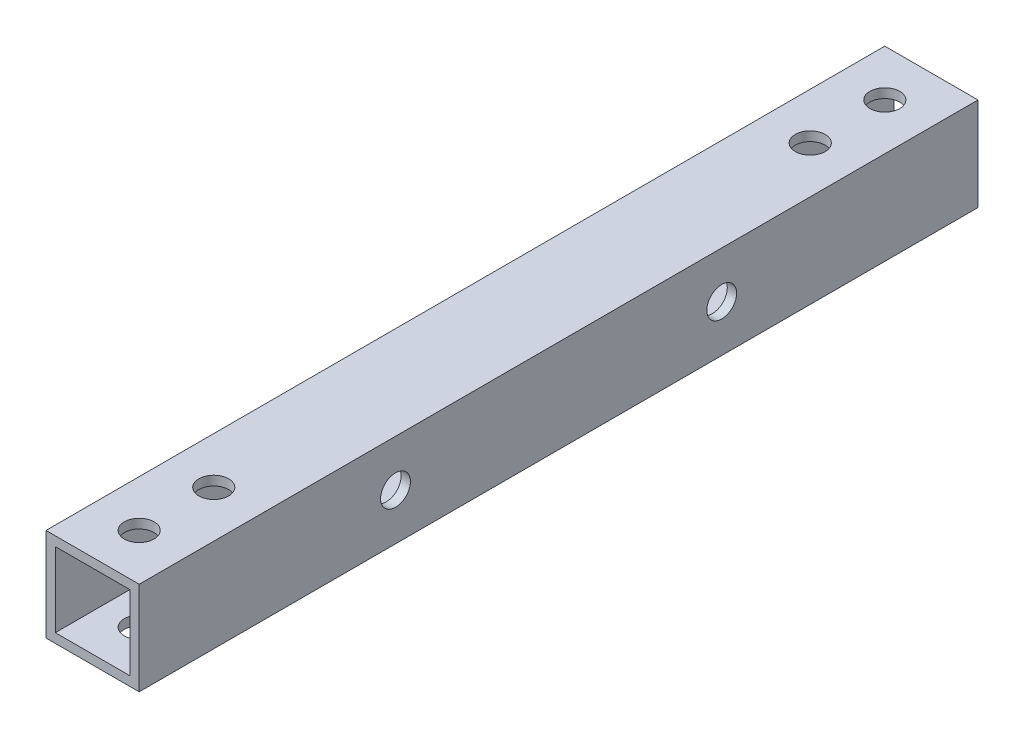
ISO-10303-21;
HEADER;
FILE_DESCRIPTION(('STEP AP214'),'2;1');
FILE_NAME('part.step','',(''),(''),'','','');
FILE_SCHEMA(('AUTOMOTIVE_DESIGN { 1 0 10303 214 1 1 1 1 }'));
ENDSEC;
DATA;
#1=APPLICATION_CONTEXT('core data for automotive mechanical design processes');
#2=APPLICATION_PROTOCOL_DEFINITION('international standard','automotive_design',2000,#1);
#3=PRODUCT_CONTEXT('',#1,'mechanical');
#4=PRODUCT('Part','Part','',(#3));
#5=PRODUCT_RELATED_PRODUCT_CATEGORY('part','',(#4));
#6=PRODUCT_DEFINITION_FORMATION('','',#4);
#7=PRODUCT_DEFINITION_CONTEXT('part definition',#1,'design');
#8=PRODUCT_DEFINITION('design','',#6,#7);
#9=PRODUCT_DEFINITION_SHAPE('','',#8);
#10=(LENGTH_UNIT() NAMED_UNIT(*) SI_UNIT(.MILLI.,.METRE.));
#11=(NAMED_UNIT(*) PLANE_ANGLE_UNIT() SI_UNIT($,.RADIAN.));
#12=(NAMED_UNIT(*) SI_UNIT($,.STERADIAN.) SOLID_ANGLE_UNIT());
#13=UNCERTAINTY_MEASURE_WITH_UNIT(LENGTH_MEASURE(1.E-05),#10,'distance_accuracy_value','');
#14=(GEOMETRIC_REPRESENTATION_CONTEXT(3) GLOBAL_UNCERTAINTY_ASSIGNED_CONTEXT((#13)) GLOBAL_UNIT_ASSIGNED_CONTEXT((#10,
#11,#12)) REPRESENTATION_CONTEXT('',''));
#15=CARTESIAN_POINT('',(0.,0.,0.));
#16=DIRECTION('',(0.,0.,1.));
#17=DIRECTION('',(1.,0.,0.));
#18=AXIS2_PLACEMENT_3D('',#15,#16,#17);
#19=CARTESIAN_POINT('',(0.,0.,90.));
#20=DIRECTION('',(0.,0.,1.));
#21=DIRECTION('',(1.,0.,0.));
#22=AXIS2_PLACEMENT_3D('',#19,#20,#21);
#23=PLANE('',#22);
#24=DIRECTION('',(0.,1.,0.));
#25=VECTOR('',#24,1.);
#26=CARTESIAN_POINT('',(5.,-5.,90.));
#27=LINE('',#26,#25);
#28=CARTESIAN_POINT('',(5.,-5.,90.));
#29=VERTEX_POINT('',#28);
#30=CARTESIAN_POINT('',(5.,5.,90.));
#31=VERTEX_POINT('',#30);
#32=EDGE_CURVE('E162',#29,#31,#27,.T.);
#33=ORIENTED_EDGE('',*,*,#32,.T.);
#34=DIRECTION('',(-1.,0.,0.));
#35=VECTOR('',#34,1.);
#36=CARTESIAN_POINT('',(-5.,5.,90.));
#37=LINE('',#36,#35);
#38=CARTESIAN_POINT('',(-5.,5.,90.));
#39=VERTEX_POINT('',#38);
#40=EDGE_CURVE('E165',#31,#39,#37,.T.);
#41=ORIENTED_EDGE('',*,*,#40,.T.);
#42=DIRECTION('',(0.,-1.,0.));
#43=VECTOR('',#42,1.);
#44=CARTESIAN_POINT('',(-5.,-5.,90.));
#45=LINE('',#44,#43);
#46=CARTESIAN_POINT('',(-5.,-5.,90.));
#47=VERTEX_POINT('',#46);
#48=EDGE_CURVE('E168',#39,#47,#45,.T.);
#49=ORIENTED_EDGE('',*,*,#48,.T.);
#50=DIRECTION('',(1.,0.,0.));
#51=VECTOR('',#50,1.);
#52=CARTESIAN_POINT('',(-5.,-5.,90.));
#53=LINE('',#52,#51);
#54=EDGE_CURVE('E170',#47,#29,#53,.T.);
#55=ORIENTED_EDGE('',*,*,#54,.T.);
#56=EDGE_LOOP('',(#33,#41,#49,#55));
#57=FACE_BOUND('',#56,.T.);
#58=DIRECTION('',(-1.,0.,0.));
#59=VECTOR('',#58,1.);
#60=CARTESIAN_POINT('',(0.,4.,90.));
#61=LINE('',#60,#59);
#62=CARTESIAN_POINT('',(4.,4.,90.));
#63=VERTEX_POINT('',#62);
#64=CARTESIAN_POINT('',(-4.,4.,90.));
#65=VERTEX_POINT('',#64);
#66=EDGE_CURVE('E132',#63,#65,#61,.T.);
#67=ORIENTED_EDGE('',*,*,#66,.F.);
#68=DIRECTION('',(0.,1.,0.));
#69=VECTOR('',#68,1.);
#70=CARTESIAN_POINT('',(4.,0.,90.));
#71=LINE('',#70,#69);
#72=CARTESIAN_POINT('',(4.,-4.,90.));
#73=VERTEX_POINT('',#72);
#74=EDGE_CURVE('E124',#73,#63,#71,.T.);
#75=ORIENTED_EDGE('',*,*,#74,.F.);
#76=DIRECTION('',(1.,0.,0.));
#77=VECTOR('',#76,1.);
#78=CARTESIAN_POINT('',(0.,-4.,90.));
#79=LINE('',#78,#77);
#80=CARTESIAN_POINT('',(-4.,-4.,90.));
#81=VERTEX_POINT('',#80);
#82=EDGE_CURVE('E146',#81,#73,#79,.T.);
#83=ORIENTED_EDGE('',*,*,#82,.F.);
#84=DIRECTION('',(0.,-1.,0.));
#85=VECTOR('',#84,1.);
#86=CARTESIAN_POINT('',(-4.,0.,90.));
#87=LINE('',#86,#85);
#88=EDGE_CURVE('E144',#65,#81,#87,.T.);
#89=ORIENTED_EDGE('',*,*,#88,.F.);
#90=EDGE_LOOP('',(#67,#75,#83,#89));
#91=FACE_BOUND('',#90,.T.);
#92=ADVANCED_FACE('F57',(#57,#91),#23,.T.);
#93=CARTESIAN_POINT('',(0.,0.,0.));
#94=DIRECTION('',(0.,0.,1.));
#95=DIRECTION('',(1.,0.,0.));
#96=AXIS2_PLACEMENT_3D('',#93,#94,#95);
#97=PLANE('',#96);
#98=DIRECTION('',(0.,1.,0.));
#99=VECTOR('',#98,1.);
#100=CARTESIAN_POINT('',(5.,-5.,0.));
#101=LINE('',#100,#99);
#102=CARTESIAN_POINT('',(5.,-5.,0.));
#103=VERTEX_POINT('',#102);
#104=CARTESIAN_POINT('',(5.,5.,0.));
#105=VERTEX_POINT('',#104);
#106=EDGE_CURVE('E140',#103,#105,#101,.T.);
#107=ORIENTED_EDGE('',*,*,#106,.F.);
#108=DIRECTION('',(1.,0.,0.));
#109=VECTOR('',#108,1.);
#110=CARTESIAN_POINT('',(-5.,-5.,0.));
#111=LINE('',#110,#109);
#112=CARTESIAN_POINT('',(-5.,-5.,0.));
#113=VERTEX_POINT('',#112);
#114=EDGE_CURVE('E166',#113,#103,#111,.T.);
#115=ORIENTED_EDGE('',*,*,#114,.F.);
#116=DIRECTION('',(0.,-1.,0.));
#117=VECTOR('',#116,1.);
#118=CARTESIAN_POINT('',(-5.,-5.,0.));
#119=LINE('',#118,#117);
#120=CARTESIAN_POINT('',(-5.,5.,0.));
#121=VERTEX_POINT('',#120);
#122=EDGE_CURVE('E177',#121,#113,#119,.T.);
#123=ORIENTED_EDGE('',*,*,#122,.F.);
#124=DIRECTION('',(-1.,0.,0.));
#125=VECTOR('',#124,1.);
#126=CARTESIAN_POINT('',(-5.,5.,0.));
#127=LINE('',#126,#125);
#128=EDGE_CURVE('E175',#105,#121,#127,.T.);
#129=ORIENTED_EDGE('',*,*,#128,.F.);
#130=EDGE_LOOP('',(#107,#115,#123,#129));
#131=FACE_BOUND('',#130,.T.);
#132=DIRECTION('',(0.,1.,0.));
#133=VECTOR('',#132,1.);
#134=CARTESIAN_POINT('',(4.,0.,0.));
#135=LINE('',#134,#133);
#136=CARTESIAN_POINT('',(4.,-4.,0.));
#137=VERTEX_POINT('',#136);
#138=CARTESIAN_POINT('',(4.,4.,0.));
#139=VERTEX_POINT('',#138);
#140=EDGE_CURVE('E82',#137,#139,#135,.T.);
#141=ORIENTED_EDGE('',*,*,#140,.T.);
#142=DIRECTION('',(-1.,0.,0.));
#143=VECTOR('',#142,1.);
#144=CARTESIAN_POINT('',(0.,4.,0.));
#145=LINE('',#144,#143);
#146=CARTESIAN_POINT('',(-4.,4.,0.));
#147=VERTEX_POINT('',#146);
#148=EDGE_CURVE('E139',#139,#147,#145,.T.);
#149=ORIENTED_EDGE('',*,*,#148,.T.);
#150=DIRECTION('',(0.,-1.,0.));
#151=VECTOR('',#150,1.);
#152=CARTESIAN_POINT('',(-4.,0.,0.));
#153=LINE('',#152,#151);
#154=CARTESIAN_POINT('',(-4.,-4.,0.));
#155=VERTEX_POINT('',#154);
#156=EDGE_CURVE('E154',#147,#155,#153,.T.);
#157=ORIENTED_EDGE('',*,*,#156,.T.);
#158=DIRECTION('',(1.,0.,0.));
#159=VECTOR('',#158,1.);
#160=CARTESIAN_POINT('',(0.,-4.,0.));
#161=LINE('',#160,#159);
#162=EDGE_CURVE('E133',#155,#137,#161,.T.);
#163=ORIENTED_EDGE('',*,*,#162,.T.);
#164=EDGE_LOOP('',(#141,#149,#157,#163));
#165=FACE_BOUND('',#164,.T.);
#166=ADVANCED_FACE('F294',(#131,#165),#97,.F.);
#167=CARTESIAN_POINT('',(5.,-5.,90.));
#168=DIRECTION('',(-1.,0.,0.));
#169=DIRECTION('',(0.,0.,1.));
#170=AXIS2_PLACEMENT_3D('',#167,#168,#169);
#171=PLANE('',#170);
#172=CARTESIAN_POINT('',(5.,0.,27.5));
#173=DIRECTION('',(1.,0.,0.));
#174=DIRECTION('',(0.,0.,-1.));
#175=AXIS2_PLACEMENT_3D('',#172,#173,#174);
#176=CIRCLE('',#175,1.60000000000001);
#177=CARTESIAN_POINT('',(5.,0.,25.9));
#178=VERTEX_POINT('',#177);
#179=EDGE_CURVE('E211',#178,#178,#176,.T.);
#180=ORIENTED_EDGE('',*,*,#179,.F.);
#181=EDGE_LOOP('',(#180));
#182=FACE_BOUND('',#181,.T.);
#183=CARTESIAN_POINT('',(5.,0.,62.5));
#184=DIRECTION('',(1.,0.,0.));
#185=DIRECTION('',(0.,0.,1.));
#186=AXIS2_PLACEMENT_3D('',#183,#184,#185);
#187=CIRCLE('',#186,1.60000000000001);
#188=CARTESIAN_POINT('',(5.,0.,64.1));
#189=VERTEX_POINT('',#188);
#190=EDGE_CURVE('E221',#189,#189,#187,.T.);
#191=ORIENTED_EDGE('',*,*,#190,.F.);
#192=EDGE_LOOP('',(#191));
#193=FACE_BOUND('',#192,.T.);
#194=ORIENTED_EDGE('',*,*,#106,.T.);
#195=DIRECTION('',(0.,0.,-1.));
#196=VECTOR('',#195,1.);
#197=CARTESIAN_POINT('',(5.,5.,90.));
#198=LINE('',#197,#196);
#199=EDGE_CURVE('E12',#31,#105,#198,.T.);
#200=ORIENTED_EDGE('',*,*,#199,.F.);
#201=ORIENTED_EDGE('',*,*,#32,.F.);
#202=DIRECTION('',(0.,0.,-1.));
#203=VECTOR('',#202,1.);
#204=CARTESIAN_POINT('',(5.,-5.,90.));
#205=LINE('',#204,#203);
#206=EDGE_CURVE('E172',#29,#103,#205,.T.);
#207=ORIENTED_EDGE('',*,*,#206,.T.);
#208=EDGE_LOOP('',(#194,#200,#201,#207));
#209=FACE_BOUND('',#208,.T.);
#210=ADVANCED_FACE('F59',(#182,#193,#209),#171,.F.);
#211=CARTESIAN_POINT('',(-5.,5.,90.));
#212=DIRECTION('',(0.,-1.,0.));
#213=DIRECTION('',(0.,0.,-1.));
#214=AXIS2_PLACEMENT_3D('',#211,#212,#213);
#215=PLANE('',#214);
#216=CARTESIAN_POINT('',(0.,5.,5.));
#217=DIRECTION('',(0.,1.,0.));
#218=DIRECTION('',(0.,0.,1.));
#219=AXIS2_PLACEMENT_3D('',#216,#217,#218);
#220=CIRCLE('',#219,1.6);
#221=CARTESIAN_POINT('',(0.,5.,6.6));
#222=VERTEX_POINT('',#221);
#223=EDGE_CURVE('E230',#222,#222,#220,.T.);
#224=ORIENTED_EDGE('',*,*,#223,.F.);
#225=EDGE_LOOP('',(#224));
#226=FACE_BOUND('',#225,.T.);
#227=CARTESIAN_POINT('',(0.,5.,77.));
#228=DIRECTION('',(0.,1.,0.));
#229=DIRECTION('',(0.,0.,1.));
#230=AXIS2_PLACEMENT_3D('',#227,#228,#229);
#231=CIRCLE('',#230,1.60000000000001);
#232=CARTESIAN_POINT('',(0.,5.,78.6));
#233=VERTEX_POINT('',#232);
#234=EDGE_CURVE('E227',#233,#233,#231,.T.);
#235=ORIENTED_EDGE('',*,*,#234,.F.);
#236=EDGE_LOOP('',(#235));
#237=FACE_BOUND('',#236,.T.);
#238=CARTESIAN_POINT('',(0.,5.,13.));
#239=DIRECTION('',(0.,1.,0.));
#240=DIRECTION('',(0.,0.,1.));
#241=AXIS2_PLACEMENT_3D('',#238,#239,#240);
#242=CIRCLE('',#241,1.6);
#243=CARTESIAN_POINT('',(0.,5.,14.6));
#244=VERTEX_POINT('',#243);
#245=EDGE_CURVE('E237',#244,#244,#242,.T.);
#246=ORIENTED_EDGE('',*,*,#245,.F.);
#247=EDGE_LOOP('',(#246));
#248=FACE_BOUND('',#247,.T.);
#249=CARTESIAN_POINT('',(0.,5.,85.));
#250=DIRECTION('',(0.,1.,0.));
#251=DIRECTION('',(0.,0.,-1.));
#252=AXIS2_PLACEMENT_3D('',#249,#250,#251);
#253=CIRCLE('',#252,1.60000000000001);
#254=CARTESIAN_POINT('',(0.,5.,83.4));
#255=VERTEX_POINT('',#254);
#256=EDGE_CURVE('E242',#255,#255,#253,.T.);
#257=ORIENTED_EDGE('',*,*,#256,.F.);
#258=EDGE_LOOP('',(#257));
#259=FACE_BOUND('',#258,.T.);
#260=ORIENTED_EDGE('',*,*,#128,.T.);
#261=DIRECTION('',(0.,0.,-1.));
#262=VECTOR('',#261,1.);
#263=CARTESIAN_POINT('',(-5.,5.,90.));
#264=LINE('',#263,#262);
#265=EDGE_CURVE('E66',#39,#121,#264,.T.);
#266=ORIENTED_EDGE('',*,*,#265,.F.);
#267=ORIENTED_EDGE('',*,*,#40,.F.);
#268=ORIENTED_EDGE('',*,*,#199,.T.);
#269=EDGE_LOOP('',(#260,#266,#267,#268));
#270=FACE_BOUND('',#269,.T.);
#271=ADVANCED_FACE('F280',(#226,#237,#248,#259,#270),#215,.F.);
#272=CARTESIAN_POINT('',(-5.,-5.,90.));
#273=DIRECTION('',(1.,0.,0.));
#274=DIRECTION('',(0.,0.,-1.));
#275=AXIS2_PLACEMENT_3D('',#272,#273,#274);
#276=PLANE('',#275);
#277=CARTESIAN_POINT('',(-5.,0.,27.5));
#278=DIRECTION('',(1.,0.,0.));
#279=DIRECTION('',(0.,0.,-1.));
#280=AXIS2_PLACEMENT_3D('',#277,#278,#279);
#281=CIRCLE('',#280,1.60000000000001);
#282=CARTESIAN_POINT('',(-5.,0.,25.9));
#283=VERTEX_POINT('',#282);
#284=EDGE_CURVE('E205',#283,#283,#281,.T.);
#285=ORIENTED_EDGE('',*,*,#284,.T.);
#286=EDGE_LOOP('',(#285));
#287=FACE_BOUND('',#286,.T.);
#288=CARTESIAN_POINT('',(-5.,0.,62.5));
#289=DIRECTION('',(1.,0.,0.));
#290=DIRECTION('',(0.,0.,1.));
#291=AXIS2_PLACEMENT_3D('',#288,#289,#290);
#292=CIRCLE('',#291,1.60000000000001);
#293=CARTESIAN_POINT('',(-5.,0.,64.1));
#294=VERTEX_POINT('',#293);
#295=EDGE_CURVE('E216',#294,#294,#292,.T.);
#296=ORIENTED_EDGE('',*,*,#295,.T.);
#297=EDGE_LOOP('',(#296));
#298=FACE_BOUND('',#297,.T.);
#299=ORIENTED_EDGE('',*,*,#122,.T.);
#300=DIRECTION('',(0.,0.,-1.));
#301=VECTOR('',#300,1.);
#302=CARTESIAN_POINT('',(-5.,-5.,90.));
#303=LINE('',#302,#301);
#304=EDGE_CURVE('E182',#47,#113,#303,.T.);
#305=ORIENTED_EDGE('',*,*,#304,.F.);
#306=ORIENTED_EDGE('',*,*,#48,.F.);
#307=ORIENTED_EDGE('',*,*,#265,.T.);
#308=EDGE_LOOP('',(#299,#305,#306,#307));
#309=FACE_BOUND('',#308,.T.);
#310=ADVANCED_FACE('F283',(#287,#298,#309),#276,.F.);
#311=CARTESIAN_POINT('',(-5.,-5.,90.));
#312=DIRECTION('',(0.,1.,0.));
#313=DIRECTION('',(0.,0.,1.));
#314=AXIS2_PLACEMENT_3D('',#311,#312,#313);
#315=PLANE('',#314);
#316=CARTESIAN_POINT('',(0.,-5.,5.));
#317=DIRECTION('',(0.,1.,0.));
#318=DIRECTION('',(0.,0.,1.));
#319=AXIS2_PLACEMENT_3D('',#316,#317,#318);
#320=CIRCLE('',#319,1.6);
#321=CARTESIAN_POINT('',(0.,-5.,6.6));
#322=VERTEX_POINT('',#321);
#323=EDGE_CURVE('E191',#322,#322,#320,.T.);
#324=ORIENTED_EDGE('',*,*,#323,.T.);
#325=EDGE_LOOP('',(#324));
#326=FACE_BOUND('',#325,.T.);
#327=CARTESIAN_POINT('',(0.,-5.,77.));
#328=DIRECTION('',(0.,1.,0.));
#329=DIRECTION('',(0.,0.,1.));
#330=AXIS2_PLACEMENT_3D('',#327,#328,#329);
#331=CIRCLE('',#330,1.60000000000001);
#332=CARTESIAN_POINT('',(0.,-5.,78.6));
#333=VERTEX_POINT('',#332);
#334=EDGE_CURVE('E234',#333,#333,#331,.T.);
#335=ORIENTED_EDGE('',*,*,#334,.T.);
#336=EDGE_LOOP('',(#335));
#337=FACE_BOUND('',#336,.T.);
#338=CARTESIAN_POINT('',(0.,-5.,13.));
#339=DIRECTION('',(0.,1.,0.));
#340=DIRECTION('',(0.,0.,1.));
#341=AXIS2_PLACEMENT_3D('',#338,#339,#340);
#342=CIRCLE('',#341,1.6);
#343=CARTESIAN_POINT('',(0.,-5.,14.6));
#344=VERTEX_POINT('',#343);
#345=EDGE_CURVE('E245',#344,#344,#342,.T.);
#346=ORIENTED_EDGE('',*,*,#345,.T.);
#347=EDGE_LOOP('',(#346));
#348=FACE_BOUND('',#347,.T.);
#349=CARTESIAN_POINT('',(0.,-5.,85.));
#350=DIRECTION('',(0.,1.,0.));
#351=DIRECTION('',(0.,0.,-1.));
#352=AXIS2_PLACEMENT_3D('',#349,#350,#351);
#353=CIRCLE('',#352,1.60000000000001);
#354=CARTESIAN_POINT('',(0.,-5.,83.4));
#355=VERTEX_POINT('',#354);
#356=EDGE_CURVE('E233',#355,#355,#353,.T.);
#357=ORIENTED_EDGE('',*,*,#356,.T.);
#358=EDGE_LOOP('',(#357));
#359=FACE_BOUND('',#358,.T.);
#360=ORIENTED_EDGE('',*,*,#114,.T.);
#361=ORIENTED_EDGE('',*,*,#206,.F.);
#362=ORIENTED_EDGE('',*,*,#54,.F.);
#363=ORIENTED_EDGE('',*,*,#304,.T.);
#364=EDGE_LOOP('',(#360,#361,#362,#363));
#365=FACE_BOUND('',#364,.T.);
#366=ADVANCED_FACE('F298',(#326,#337,#348,#359,#365),#315,.F.);
#367=CARTESIAN_POINT('',(4.,0.,90.));
#368=DIRECTION('',(-1.,0.,0.));
#369=DIRECTION('',(0.,0.,1.));
#370=AXIS2_PLACEMENT_3D('',#367,#368,#369);
#371=PLANE('',#370);
#372=CARTESIAN_POINT('',(4.,0.,27.5));
#373=DIRECTION('',(-1.,0.,0.));
#374=DIRECTION('',(0.,0.,1.));
#375=AXIS2_PLACEMENT_3D('',#372,#373,#374);
#376=CIRCLE('',#375,1.60000000000001);
#377=CARTESIAN_POINT('',(4.,0.,29.1));
#378=VERTEX_POINT('',#377);
#379=EDGE_CURVE('E224',#378,#378,#376,.T.);
#380=ORIENTED_EDGE('',*,*,#379,.F.);
#381=EDGE_LOOP('',(#380));
#382=FACE_BOUND('',#381,.T.);
#383=CARTESIAN_POINT('',(4.,0.,62.5));
#384=DIRECTION('',(-1.,0.,0.));
#385=DIRECTION('',(0.,0.,1.));
#386=AXIS2_PLACEMENT_3D('',#383,#384,#385);
#387=CIRCLE('',#386,1.60000000000001);
#388=CARTESIAN_POINT('',(4.,0.,64.1));
#389=VERTEX_POINT('',#388);
#390=EDGE_CURVE('E204',#389,#389,#387,.T.);
#391=ORIENTED_EDGE('',*,*,#390,.F.);
#392=EDGE_LOOP('',(#391));
#393=FACE_BOUND('',#392,.T.);
#394=ORIENTED_EDGE('',*,*,#140,.F.);
#395=DIRECTION('',(0.,0.,-1.));
#396=VECTOR('',#395,1.);
#397=CARTESIAN_POINT('',(4.,-4.,90.));
#398=LINE('',#397,#396);
#399=EDGE_CURVE('E128',#73,#137,#398,.T.);
#400=ORIENTED_EDGE('',*,*,#399,.F.);
#401=ORIENTED_EDGE('',*,*,#74,.T.);
#402=DIRECTION('',(0.,0.,-1.));
#403=VECTOR('',#402,1.);
#404=CARTESIAN_POINT('',(4.,4.,90.));
#405=LINE('',#404,#403);
#406=EDGE_CURVE('E127',#63,#139,#405,.T.);
#407=ORIENTED_EDGE('',*,*,#406,.T.);
#408=EDGE_LOOP('',(#394,#400,#401,#407));
#409=FACE_BOUND('',#408,.T.);
#410=ADVANCED_FACE('F126',(#382,#393,#409),#371,.T.);
#411=CARTESIAN_POINT('',(0.,4.,90.));
#412=DIRECTION('',(0.,-1.,0.));
#413=DIRECTION('',(0.,0.,-1.));
#414=AXIS2_PLACEMENT_3D('',#411,#412,#413);
#415=PLANE('',#414);
#416=CARTESIAN_POINT('',(0.,4.,5.));
#417=DIRECTION('',(0.,-1.,0.));
#418=DIRECTION('',(0.,0.,-1.));
#419=AXIS2_PLACEMENT_3D('',#416,#417,#418);
#420=CIRCLE('',#419,1.6);
#421=CARTESIAN_POINT('',(0.,4.,3.4));
#422=VERTEX_POINT('',#421);
#423=EDGE_CURVE('E152',#422,#422,#420,.T.);
#424=ORIENTED_EDGE('',*,*,#423,.F.);
#425=EDGE_LOOP('',(#424));
#426=FACE_BOUND('',#425,.T.);
#427=CARTESIAN_POINT('',(0.,4.,77.));
#428=DIRECTION('',(0.,-1.,0.));
#429=DIRECTION('',(0.,0.,-1.));
#430=AXIS2_PLACEMENT_3D('',#427,#428,#429);
#431=CIRCLE('',#430,1.60000000000001);
#432=CARTESIAN_POINT('',(0.,4.,75.4));
#433=VERTEX_POINT('',#432);
#434=EDGE_CURVE('E199',#433,#433,#431,.T.);
#435=ORIENTED_EDGE('',*,*,#434,.F.);
#436=EDGE_LOOP('',(#435));
#437=FACE_BOUND('',#436,.T.);
#438=CARTESIAN_POINT('',(0.,4.,13.));
#439=DIRECTION('',(0.,-1.,0.));
#440=DIRECTION('',(0.,0.,-1.));
#441=AXIS2_PLACEMENT_3D('',#438,#439,#440);
#442=CIRCLE('',#441,1.6);
#443=CARTESIAN_POINT('',(0.,4.,11.4));
#444=VERTEX_POINT('',#443);
#445=EDGE_CURVE('E195',#444,#444,#442,.T.);
#446=ORIENTED_EDGE('',*,*,#445,.F.);
#447=EDGE_LOOP('',(#446));
#448=FACE_BOUND('',#447,.T.);
#449=CARTESIAN_POINT('',(0.,4.,85.));
#450=DIRECTION('',(0.,-1.,0.));
#451=DIRECTION('',(0.,0.,-1.));
#452=AXIS2_PLACEMENT_3D('',#449,#450,#451);
#453=CIRCLE('',#452,1.60000000000001);
#454=CARTESIAN_POINT('',(0.,4.,83.4));
#455=VERTEX_POINT('',#454);
#456=EDGE_CURVE('E190',#455,#455,#453,.T.);
#457=ORIENTED_EDGE('',*,*,#456,.F.);
#458=EDGE_LOOP('',(#457));
#459=FACE_BOUND('',#458,.T.);
#460=ORIENTED_EDGE('',*,*,#148,.F.);
#461=ORIENTED_EDGE('',*,*,#406,.F.);
#462=ORIENTED_EDGE('',*,*,#66,.T.);
#463=DIRECTION('',(0.,0.,-1.));
#464=VECTOR('',#463,1.);
#465=CARTESIAN_POINT('',(-4.,4.,90.));
#466=LINE('',#465,#464);
#467=EDGE_CURVE('E141',#65,#147,#466,.T.);
#468=ORIENTED_EDGE('',*,*,#467,.T.);
#469=EDGE_LOOP('',(#460,#461,#462,#468));
#470=FACE_BOUND('',#469,.T.);
#471=ADVANCED_FACE('F136',(#426,#437,#448,#459,#470),#415,.T.);
#472=CARTESIAN_POINT('',(-4.,0.,90.));
#473=DIRECTION('',(1.,0.,0.));
#474=DIRECTION('',(0.,0.,-1.));
#475=AXIS2_PLACEMENT_3D('',#472,#473,#474);
#476=PLANE('',#475);
#477=CARTESIAN_POINT('',(-4.,0.,27.5));
#478=DIRECTION('',(1.,0.,0.));
#479=DIRECTION('',(0.,0.,-1.));
#480=AXIS2_PLACEMENT_3D('',#477,#478,#479);
#481=CIRCLE('',#480,1.60000000000001);
#482=CARTESIAN_POINT('',(-4.,0.,25.9));
#483=VERTEX_POINT('',#482);
#484=EDGE_CURVE('E61',#483,#483,#481,.T.);
#485=ORIENTED_EDGE('',*,*,#484,.F.);
#486=EDGE_LOOP('',(#485));
#487=FACE_BOUND('',#486,.T.);
#488=CARTESIAN_POINT('',(-4.,0.,62.5));
#489=DIRECTION('',(1.,0.,0.));
#490=DIRECTION('',(0.,0.,-1.));
#491=AXIS2_PLACEMENT_3D('',#488,#489,#490);
#492=CIRCLE('',#491,1.60000000000001);
#493=CARTESIAN_POINT('',(-4.,0.,60.9));
#494=VERTEX_POINT('',#493);
#495=EDGE_CURVE('E202',#494,#494,#492,.T.);
#496=ORIENTED_EDGE('',*,*,#495,.F.);
#497=EDGE_LOOP('',(#496));
#498=FACE_BOUND('',#497,.T.);
#499=ORIENTED_EDGE('',*,*,#156,.F.);
#500=ORIENTED_EDGE('',*,*,#467,.F.);
#501=ORIENTED_EDGE('',*,*,#88,.T.);
#502=DIRECTION('',(0.,0.,-1.));
#503=VECTOR('',#502,1.);
#504=CARTESIAN_POINT('',(-4.,-4.,90.));
#505=LINE('',#504,#503);
#506=EDGE_CURVE('E74',#81,#155,#505,.T.);
#507=ORIENTED_EDGE('',*,*,#506,.T.);
#508=EDGE_LOOP('',(#499,#500,#501,#507));
#509=FACE_BOUND('',#508,.T.);
#510=ADVANCED_FACE('F263',(#487,#498,#509),#476,.T.);
#511=CARTESIAN_POINT('',(0.,-4.,90.));
#512=DIRECTION('',(0.,1.,0.));
#513=DIRECTION('',(0.,0.,1.));
#514=AXIS2_PLACEMENT_3D('',#511,#512,#513);
#515=PLANE('',#514);
#516=CARTESIAN_POINT('',(0.,-4.,5.));
#517=DIRECTION('',(0.,1.,0.));
#518=DIRECTION('',(0.,0.,1.));
#519=AXIS2_PLACEMENT_3D('',#516,#517,#518);
#520=CIRCLE('',#519,1.6);
#521=CARTESIAN_POINT('',(0.,-4.,6.6));
#522=VERTEX_POINT('',#521);
#523=EDGE_CURVE('E200',#522,#522,#520,.T.);
#524=ORIENTED_EDGE('',*,*,#523,.F.);
#525=EDGE_LOOP('',(#524));
#526=FACE_BOUND('',#525,.T.);
#527=CARTESIAN_POINT('',(0.,-4.,77.));
#528=DIRECTION('',(0.,1.,0.));
#529=DIRECTION('',(0.,0.,1.));
#530=AXIS2_PLACEMENT_3D('',#527,#528,#529);
#531=CIRCLE('',#530,1.60000000000001);
#532=CARTESIAN_POINT('',(0.,-4.,78.6));
#533=VERTEX_POINT('',#532);
#534=EDGE_CURVE('E196',#533,#533,#531,.T.);
#535=ORIENTED_EDGE('',*,*,#534,.F.);
#536=EDGE_LOOP('',(#535));
#537=FACE_BOUND('',#536,.T.);
#538=CARTESIAN_POINT('',(0.,-4.,13.));
#539=DIRECTION('',(0.,1.,0.));
#540=DIRECTION('',(0.,0.,1.));
#541=AXIS2_PLACEMENT_3D('',#538,#539,#540);
#542=CIRCLE('',#541,1.6);
#543=CARTESIAN_POINT('',(0.,-4.,14.6));
#544=VERTEX_POINT('',#543);
#545=EDGE_CURVE('E192',#544,#544,#542,.T.);
#546=ORIENTED_EDGE('',*,*,#545,.F.);
#547=EDGE_LOOP('',(#546));
#548=FACE_BOUND('',#547,.T.);
#549=CARTESIAN_POINT('',(0.,-4.,85.));
#550=DIRECTION('',(0.,1.,0.));
#551=DIRECTION('',(0.,0.,1.));
#552=AXIS2_PLACEMENT_3D('',#549,#550,#551);
#553=CIRCLE('',#552,1.60000000000001);
#554=CARTESIAN_POINT('',(0.,-4.,86.6));
#555=VERTEX_POINT('',#554);
#556=EDGE_CURVE('E187',#555,#555,#553,.T.);
#557=ORIENTED_EDGE('',*,*,#556,.F.);
#558=EDGE_LOOP('',(#557));
#559=FACE_BOUND('',#558,.T.);
#560=ORIENTED_EDGE('',*,*,#162,.F.);
#561=ORIENTED_EDGE('',*,*,#506,.F.);
#562=ORIENTED_EDGE('',*,*,#82,.T.);
#563=ORIENTED_EDGE('',*,*,#399,.T.);
#564=EDGE_LOOP('',(#560,#561,#562,#563));
#565=FACE_BOUND('',#564,.T.);
#566=ADVANCED_FACE('F381',(#526,#537,#548,#559,#565),#515,.T.);
#567=CARTESIAN_POINT('',(0.,-5.,85.));
#568=DIRECTION('',(0.,1.,0.));
#569=DIRECTION('',(0.,0.,1.));
#570=AXIS2_PLACEMENT_3D('',#567,#568,#569);
#571=CYLINDRICAL_SURFACE('',#570,1.60000000000001);
#572=ORIENTED_EDGE('',*,*,#556,.T.);
#573=EDGE_LOOP('',(#572));
#574=FACE_BOUND('',#573,.T.);
#575=ORIENTED_EDGE('',*,*,#356,.F.);
#576=EDGE_LOOP('',(#575));
#577=FACE_BOUND('',#576,.T.);
#578=ADVANCED_FACE('F277',(#574,#577),#571,.F.);
#579=CARTESIAN_POINT('',(0.,-5.,13.));
#580=DIRECTION('',(0.,1.,0.));
#581=DIRECTION('',(0.,0.,1.));
#582=AXIS2_PLACEMENT_3D('',#579,#580,#581);
#583=CYLINDRICAL_SURFACE('',#582,1.6);
#584=ORIENTED_EDGE('',*,*,#545,.T.);
#585=EDGE_LOOP('',(#584));
#586=FACE_BOUND('',#585,.T.);
#587=ORIENTED_EDGE('',*,*,#345,.F.);
#588=EDGE_LOOP('',(#587));
#589=FACE_BOUND('',#588,.T.);
#590=ADVANCED_FACE('F395',(#586,#589),#583,.F.);
#591=CARTESIAN_POINT('',(0.,-5.,77.));
#592=DIRECTION('',(0.,1.,0.));
#593=DIRECTION('',(0.,0.,1.));
#594=AXIS2_PLACEMENT_3D('',#591,#592,#593);
#595=CYLINDRICAL_SURFACE('',#594,1.60000000000001);
#596=ORIENTED_EDGE('',*,*,#534,.T.);
#597=EDGE_LOOP('',(#596));
#598=FACE_BOUND('',#597,.T.);
#599=ORIENTED_EDGE('',*,*,#334,.F.);
#600=EDGE_LOOP('',(#599));
#601=FACE_BOUND('',#600,.T.);
#602=ADVANCED_FACE('F404',(#598,#601),#595,.F.);
#603=CARTESIAN_POINT('',(0.,-5.,5.));
#604=DIRECTION('',(0.,1.,0.));
#605=DIRECTION('',(0.,0.,1.));
#606=AXIS2_PLACEMENT_3D('',#603,#604,#605);
#607=CYLINDRICAL_SURFACE('',#606,1.6);
#608=ORIENTED_EDGE('',*,*,#523,.T.);
#609=EDGE_LOOP('',(#608));
#610=FACE_BOUND('',#609,.T.);
#611=ORIENTED_EDGE('',*,*,#323,.F.);
#612=EDGE_LOOP('',(#611));
#613=FACE_BOUND('',#612,.T.);
#614=ADVANCED_FACE('F275',(#610,#613),#607,.F.);
#615=ORIENTED_EDGE('',*,*,#456,.T.);
#616=EDGE_LOOP('',(#615));
#617=FACE_BOUND('',#616,.T.);
#618=ORIENTED_EDGE('',*,*,#256,.T.);
#619=EDGE_LOOP('',(#618));
#620=FACE_BOUND('',#619,.T.);
#621=ADVANCED_FACE('F271',(#617,#620),#571,.F.);
#622=ORIENTED_EDGE('',*,*,#445,.T.);
#623=EDGE_LOOP('',(#622));
#624=FACE_BOUND('',#623,.T.);
#625=ORIENTED_EDGE('',*,*,#245,.T.);
#626=EDGE_LOOP('',(#625));
#627=FACE_BOUND('',#626,.T.);
#628=ADVANCED_FACE('F274',(#624,#627),#583,.F.);
#629=ORIENTED_EDGE('',*,*,#434,.T.);
#630=EDGE_LOOP('',(#629));
#631=FACE_BOUND('',#630,.T.);
#632=ORIENTED_EDGE('',*,*,#234,.T.);
#633=EDGE_LOOP('',(#632));
#634=FACE_BOUND('',#633,.T.);
#635=ADVANCED_FACE('F332',(#631,#634),#595,.F.);
#636=ORIENTED_EDGE('',*,*,#423,.T.);
#637=EDGE_LOOP('',(#636));
#638=FACE_BOUND('',#637,.T.);
#639=ORIENTED_EDGE('',*,*,#223,.T.);
#640=EDGE_LOOP('',(#639));
#641=FACE_BOUND('',#640,.T.);
#642=ADVANCED_FACE('F258',(#638,#641),#607,.F.);
#643=CARTESIAN_POINT('',(-5.,0.,62.5));
#644=DIRECTION('',(1.,0.,0.));
#645=DIRECTION('',(0.,0.,-1.));
#646=AXIS2_PLACEMENT_3D('',#643,#644,#645);
#647=CYLINDRICAL_SURFACE('',#646,1.60000000000001);
#648=ORIENTED_EDGE('',*,*,#495,.T.);
#649=EDGE_LOOP('',(#648));
#650=FACE_BOUND('',#649,.T.);
#651=ORIENTED_EDGE('',*,*,#295,.F.);
#652=EDGE_LOOP('',(#651));
#653=FACE_BOUND('',#652,.T.);
#654=ADVANCED_FACE('F320',(#650,#653),#647,.F.);
#655=CARTESIAN_POINT('',(-5.,0.,27.5));
#656=DIRECTION('',(1.,0.,0.));
#657=DIRECTION('',(0.,0.,-1.));
#658=AXIS2_PLACEMENT_3D('',#655,#656,#657);
#659=CYLINDRICAL_SURFACE('',#658,1.60000000000001);
#660=ORIENTED_EDGE('',*,*,#484,.T.);
#661=EDGE_LOOP('',(#660));
#662=FACE_BOUND('',#661,.T.);
#663=ORIENTED_EDGE('',*,*,#284,.F.);
#664=EDGE_LOOP('',(#663));
#665=FACE_BOUND('',#664,.T.);
#666=ADVANCED_FACE('F322',(#662,#665),#659,.F.);
#667=ORIENTED_EDGE('',*,*,#390,.T.);
#668=EDGE_LOOP('',(#667));
#669=FACE_BOUND('',#668,.T.);
#670=ORIENTED_EDGE('',*,*,#190,.T.);
#671=EDGE_LOOP('',(#670));
#672=FACE_BOUND('',#671,.T.);
#673=ADVANCED_FACE('F324',(#669,#672),#647,.F.);
#674=ORIENTED_EDGE('',*,*,#379,.T.);
#675=EDGE_LOOP('',(#674));
#676=FACE_BOUND('',#675,.T.);
#677=ORIENTED_EDGE('',*,*,#179,.T.);
#678=EDGE_LOOP('',(#677));
#679=FACE_BOUND('',#678,.T.);
#680=ADVANCED_FACE('F331',(#676,#679),#659,.F.);
#681=CLOSED_SHELL('',(#92,#166,#210,#271,#310,#366,#410,#471,#510,#566,#578,#590,#602,#614,#621,
#628,#635,#642,#654,#666,#673,#680));
#682=MANIFOLD_SOLID_BREP('B2',#681);
#683=ADVANCED_BREP_SHAPE_REPRESENTATION('',(#18,#682),#14);
#684=SHAPE_DEFINITION_REPRESENTATION(#9,#683);
ENDSEC;
END-ISO-10303-21;
